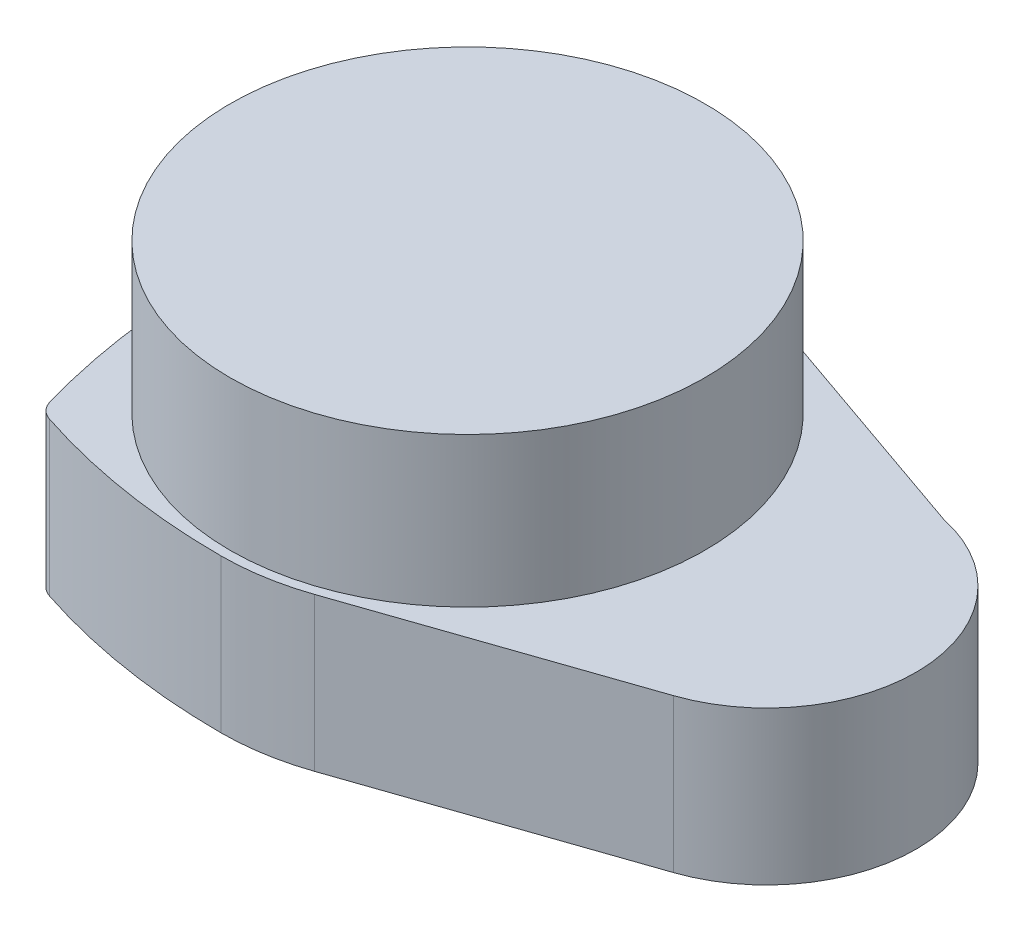
ISO-10303-21;
HEADER;
FILE_DESCRIPTION(('STEP AP214'),'2;1');
FILE_NAME('part.step','',(''),(''),'','','');
FILE_SCHEMA(('AUTOMOTIVE_DESIGN { 1 0 10303 214 1 1 1 1 }'));
ENDSEC;
DATA;
#1=APPLICATION_CONTEXT('core data for automotive mechanical design processes');
#2=APPLICATION_PROTOCOL_DEFINITION('international standard','automotive_design',2000,#1);
#3=PRODUCT_CONTEXT('',#1,'mechanical');
#4=PRODUCT('Part','Part','',(#3));
#5=PRODUCT_RELATED_PRODUCT_CATEGORY('part','',(#4));
#6=PRODUCT_DEFINITION_FORMATION('','',#4);
#7=PRODUCT_DEFINITION_CONTEXT('part definition',#1,'design');
#8=PRODUCT_DEFINITION('design','',#6,#7);
#9=PRODUCT_DEFINITION_SHAPE('','',#8);
#10=(LENGTH_UNIT() NAMED_UNIT(*) SI_UNIT(.MILLI.,.METRE.));
#11=(NAMED_UNIT(*) PLANE_ANGLE_UNIT() SI_UNIT($,.RADIAN.));
#12=(NAMED_UNIT(*) SI_UNIT($,.STERADIAN.) SOLID_ANGLE_UNIT());
#13=UNCERTAINTY_MEASURE_WITH_UNIT(LENGTH_MEASURE(1.E-05),#10,'distance_accuracy_value','');
#14=(GEOMETRIC_REPRESENTATION_CONTEXT(3) GLOBAL_UNCERTAINTY_ASSIGNED_CONTEXT((#13)) GLOBAL_UNIT_ASSIGNED_CONTEXT((#10,
#11,#12)) REPRESENTATION_CONTEXT('',''));
#15=CARTESIAN_POINT('',(0.,0.,0.));
#16=DIRECTION('',(0.,0.,1.));
#17=DIRECTION('',(1.,0.,0.));
#18=AXIS2_PLACEMENT_3D('',#15,#16,#17);
#19=CARTESIAN_POINT('',(0.,20.,0.));
#20=DIRECTION('',(0.,-1.,0.));
#21=DIRECTION('',(0.,0.,-1.));
#22=AXIS2_PLACEMENT_3D('',#19,#20,#21);
#23=CYLINDRICAL_SURFACE('',#22,31.75);
#24=CARTESIAN_POINT('',(0.,20.,0.));
#25=DIRECTION('',(0.,1.,0.));
#26=DIRECTION('',(0.,0.,1.));
#27=AXIS2_PLACEMENT_3D('',#24,#25,#26);
#28=CIRCLE('',#27,31.75);
#29=CARTESIAN_POINT('',(0.,20.,31.75));
#30=VERTEX_POINT('',#29);
#31=EDGE_CURVE('E205',#30,#30,#28,.T.);
#32=ORIENTED_EDGE('',*,*,#31,.F.);
#33=EDGE_LOOP('',(#32));
#34=FACE_BOUND('',#33,.T.);
#35=CARTESIAN_POINT('',(0.,0.,0.));
#36=DIRECTION('',(0.,1.,0.));
#37=DIRECTION('',(0.,0.,1.));
#38=AXIS2_PLACEMENT_3D('',#35,#36,#37);
#39=CIRCLE('',#38,31.75);
#40=CARTESIAN_POINT('',(0.,0.,31.75));
#41=VERTEX_POINT('',#40);
#42=EDGE_CURVE('E190',#41,#41,#39,.T.);
#43=ORIENTED_EDGE('',*,*,#42,.T.);
#44=EDGE_LOOP('',(#43));
#45=FACE_BOUND('',#44,.T.);
#46=ADVANCED_FACE('F39',(#34,#45),#23,.T.);
#47=CARTESIAN_POINT('',(0.,20.,0.));
#48=DIRECTION('',(0.,1.,0.));
#49=DIRECTION('',(0.,0.,1.));
#50=AXIS2_PLACEMENT_3D('',#47,#48,#49);
#51=PLANE('',#50);
#52=ORIENTED_EDGE('',*,*,#31,.T.);
#53=EDGE_LOOP('',(#52));
#54=FACE_BOUND('',#53,.T.);
#55=ADVANCED_FACE('F268',(#54),#51,.T.);
#56=CARTESIAN_POINT('',(44.1463840592431,-20.5,-19.5654670077986));
#57=DIRECTION('',(0.328516163866,0.,-0.944498348372705));
#58=DIRECTION('',(-0.944498348372705,0.,-0.328516163866));
#59=AXIS2_PLACEMENT_3D('',#56,#57,#58);
#60=PLANE('',#59);
#61=DIRECTION('',(-0.944498348372705,0.,-0.328516163866));
#62=VECTOR('',#61,1.);
#63=CARTESIAN_POINT('',(44.1463840592431,0.,-19.5654670077986));
#64=LINE('',#63,#62);
#65=CARTESIAN_POINT('',(44.1463840592431,0.,-19.5654670077986));
#66=VERTEX_POINT('',#65);
#67=CARTESIAN_POINT('',(11.8544434163176,0.,-30.797275387432));
#68=VERTEX_POINT('',#67);
#69=EDGE_CURVE('E168',#66,#68,#64,.T.);
#70=ORIENTED_EDGE('',*,*,#69,.F.);
#71=DIRECTION('',(0.,1.,0.));
#72=VECTOR('',#71,1.);
#73=CARTESIAN_POINT('',(44.1463840592431,-20.5,-19.5654670077986));
#74=LINE('',#73,#72);
#75=CARTESIAN_POINT('',(44.1463840592431,-20.5,-19.5654670077986));
#76=VERTEX_POINT('',#75);
#77=EDGE_CURVE('E143',#76,#66,#74,.T.);
#78=ORIENTED_EDGE('',*,*,#77,.F.);
#79=DIRECTION('',(-0.944498348372705,0.,-0.328516163866));
#80=VECTOR('',#79,1.);
#81=CARTESIAN_POINT('',(44.1463840592431,-20.5,-19.5654670077986));
#82=LINE('',#81,#80);
#83=CARTESIAN_POINT('',(11.8544434163176,-20.5,-30.797275387432));
#84=VERTEX_POINT('',#83);
#85=EDGE_CURVE('E124',#76,#84,#82,.T.);
#86=ORIENTED_EDGE('',*,*,#85,.T.);
#87=DIRECTION('',(0.,1.,0.));
#88=VECTOR('',#87,1.);
#89=CARTESIAN_POINT('',(11.8544434163176,-20.5,-30.797275387432));
#90=LINE('',#89,#88);
#91=EDGE_CURVE('E131',#84,#68,#90,.T.);
#92=ORIENTED_EDGE('',*,*,#91,.T.);
#93=EDGE_LOOP('',(#70,#78,#86,#92));
#94=FACE_BOUND('',#93,.T.);
#95=ADVANCED_FACE('F142',(#94),#60,.T.);
#96=CARTESIAN_POINT('',(40.,-20.5,0.));
#97=DIRECTION('',(0.,1.,0.));
#98=DIRECTION('',(0.,0.,1.));
#99=AXIS2_PLACEMENT_3D('',#96,#97,#98);
#100=CYLINDRICAL_SURFACE('',#99,20.);
#101=CARTESIAN_POINT('',(40.,0.,0.));
#102=DIRECTION('',(0.,-1.,0.));
#103=DIRECTION('',(0.,0.,-1.));
#104=AXIS2_PLACEMENT_3D('',#101,#102,#103);
#105=CIRCLE('',#104,20.);
#106=CARTESIAN_POINT('',(46.5,0.,18.9142803193777));
#107=VERTEX_POINT('',#106);
#108=EDGE_CURVE('E146',#66,#107,#105,.T.);
#109=ORIENTED_EDGE('',*,*,#108,.T.);
#110=DIRECTION('',(0.,1.,0.));
#111=VECTOR('',#110,1.);
#112=CARTESIAN_POINT('',(46.5,-20.5,18.9142803193777));
#113=LINE('',#112,#111);
#114=CARTESIAN_POINT('',(46.5,-20.5,18.9142803193777));
#115=VERTEX_POINT('',#114);
#116=EDGE_CURVE('E191',#115,#107,#113,.T.);
#117=ORIENTED_EDGE('',*,*,#116,.F.);
#118=CARTESIAN_POINT('',(40.,-20.5,0.));
#119=DIRECTION('',(0.,-1.,0.));
#120=DIRECTION('',(0.,0.,-1.));
#121=AXIS2_PLACEMENT_3D('',#118,#119,#120);
#122=CIRCLE('',#121,20.);
#123=EDGE_CURVE('E140',#76,#115,#122,.T.);
#124=ORIENTED_EDGE('',*,*,#123,.F.);
#125=ORIENTED_EDGE('',*,*,#77,.T.);
#126=EDGE_LOOP('',(#109,#117,#124,#125));
#127=FACE_BOUND('',#126,.T.);
#128=ADVANCED_FACE('F260',(#127),#100,.T.);
#129=CARTESIAN_POINT('',(46.5,-20.5,18.9142803193777));
#130=DIRECTION('',(-0.325,0.,-0.945714015968887));
#131=DIRECTION('',(-0.945714015968887,0.,0.325));
#132=AXIS2_PLACEMENT_3D('',#129,#130,#131);
#133=PLANE('',#132);
#134=DIRECTION('',(-0.945714015968887,0.,0.325));
#135=VECTOR('',#134,1.);
#136=CARTESIAN_POINT('',(46.5,0.,18.9142803193777));
#137=LINE('',#136,#135);
#138=CARTESIAN_POINT('',(10.725,0.,31.2085625269733));
#139=VERTEX_POINT('',#138);
#140=EDGE_CURVE('E149',#107,#139,#137,.T.);
#141=ORIENTED_EDGE('',*,*,#140,.T.);
#142=DIRECTION('',(0.,1.,0.));
#143=VECTOR('',#142,1.);
#144=CARTESIAN_POINT('',(10.725,-20.5,31.2085625269733));
#145=LINE('',#144,#143);
#146=CARTESIAN_POINT('',(10.725,-20.5,31.2085625269733));
#147=VERTEX_POINT('',#146);
#148=EDGE_CURVE('E195',#147,#139,#145,.T.);
#149=ORIENTED_EDGE('',*,*,#148,.F.);
#150=DIRECTION('',(-0.945714015968887,0.,0.325));
#151=VECTOR('',#150,1.);
#152=CARTESIAN_POINT('',(46.5,-20.5,18.9142803193777));
#153=LINE('',#152,#151);
#154=EDGE_CURVE('E163',#115,#147,#153,.T.);
#155=ORIENTED_EDGE('',*,*,#154,.F.);
#156=ORIENTED_EDGE('',*,*,#116,.T.);
#157=EDGE_LOOP('',(#141,#149,#155,#156));
#158=FACE_BOUND('',#157,.T.);
#159=ADVANCED_FACE('F256',(#158),#133,.F.);
#160=CARTESIAN_POINT('',(0.,-20.5,0.));
#161=DIRECTION('',(0.,1.,0.));
#162=DIRECTION('',(0.,0.,1.));
#163=AXIS2_PLACEMENT_3D('',#160,#161,#162);
#164=CYLINDRICAL_SURFACE('',#163,33.);
#165=CARTESIAN_POINT('',(0.,0.,0.));
#166=DIRECTION('',(0.,-1.,0.));
#167=DIRECTION('',(0.,0.,-1.));
#168=AXIS2_PLACEMENT_3D('',#165,#166,#167);
#169=CIRCLE('',#168,33.);
#170=CARTESIAN_POINT('',(-1.1319821696323E-13,0.,33.));
#171=VERTEX_POINT('',#170);
#172=EDGE_CURVE('E183',#139,#171,#169,.T.);
#173=ORIENTED_EDGE('',*,*,#172,.T.);
#174=DIRECTION('',(0.,1.,0.));
#175=VECTOR('',#174,1.);
#176=CARTESIAN_POINT('',(-1.1319821696323E-13,-20.5,33.));
#177=LINE('',#176,#175);
#178=CARTESIAN_POINT('',(-1.1319821696323E-13,-20.5,33.));
#179=VERTEX_POINT('',#178);
#180=EDGE_CURVE('E199',#179,#171,#177,.T.);
#181=ORIENTED_EDGE('',*,*,#180,.F.);
#182=CARTESIAN_POINT('',(0.,-20.5,0.));
#183=DIRECTION('',(0.,-1.,0.));
#184=DIRECTION('',(0.,0.,-1.));
#185=AXIS2_PLACEMENT_3D('',#182,#183,#184);
#186=CIRCLE('',#185,33.);
#187=EDGE_CURVE('E160',#147,#179,#186,.T.);
#188=ORIENTED_EDGE('',*,*,#187,.F.);
#189=ORIENTED_EDGE('',*,*,#148,.T.);
#190=EDGE_LOOP('',(#173,#181,#188,#189));
#191=FACE_BOUND('',#190,.T.);
#192=ADVANCED_FACE('F251',(#191),#164,.T.);
#193=CARTESIAN_POINT('',(3.4565665254547E-13,-20.5,-54.2476089400615));
#194=DIRECTION('',(0.,1.,0.));
#195=DIRECTION('',(0.,0.,1.));
#196=AXIS2_PLACEMENT_3D('',#193,#194,#195);
#197=CYLINDRICAL_SURFACE('',#196,87.2476089400615);
#198=CARTESIAN_POINT('',(3.4565665254547E-13,0.,-54.2476089400615));
#199=DIRECTION('',(0.,-1.,0.));
#200=DIRECTION('',(0.,0.,-1.));
#201=AXIS2_PLACEMENT_3D('',#198,#199,#200);
#202=CIRCLE('',#201,87.2476089400615);
#203=CARTESIAN_POINT('',(-27.316652257852,0.,28.6133938005611));
#204=VERTEX_POINT('',#203);
#205=EDGE_CURVE('E180',#171,#204,#202,.T.);
#206=ORIENTED_EDGE('',*,*,#205,.T.);
#207=DIRECTION('',(0.,1.,0.));
#208=VECTOR('',#207,1.);
#209=CARTESIAN_POINT('',(-27.316652257852,-20.5,28.6133938005611));
#210=LINE('',#209,#208);
#211=CARTESIAN_POINT('',(-27.316652257852,-20.5,28.6133938005611));
#212=VERTEX_POINT('',#211);
#213=EDGE_CURVE('E11',#204,#212,#210,.F.);
#214=ORIENTED_EDGE('',*,*,#213,.T.);
#215=CARTESIAN_POINT('',(3.4565665254547E-13,-20.5,-54.2476089400615));
#216=DIRECTION('',(0.,-1.,0.));
#217=DIRECTION('',(0.,0.,-1.));
#218=AXIS2_PLACEMENT_3D('',#215,#216,#217);
#219=CIRCLE('',#218,87.2476089400615);
#220=EDGE_CURVE('E157',#179,#212,#219,.T.);
#221=ORIENTED_EDGE('',*,*,#220,.F.);
#222=ORIENTED_EDGE('',*,*,#180,.T.);
#223=EDGE_LOOP('',(#206,#214,#221,#222));
#224=FACE_BOUND('',#223,.T.);
#225=ADVANCED_FACE('F247',(#224),#197,.T.);
#226=CARTESIAN_POINT('',(63.4292474889733,-20.5,0.));
#227=DIRECTION('',(0.,1.,0.));
#228=DIRECTION('',(0.,0.,1.));
#229=AXIS2_PLACEMENT_3D('',#226,#227,#228);
#230=CYLINDRICAL_SURFACE('',#229,96.4292474889734);
#231=CARTESIAN_POINT('',(63.4292474889733,0.,0.));
#232=DIRECTION('',(0.,-1.,0.));
#233=DIRECTION('',(0.,0.,-1.));
#234=AXIS2_PLACEMENT_3D('',#231,#232,#233);
#235=CIRCLE('',#234,96.4292474889734);
#236=CARTESIAN_POINT('',(-29.2610499224988,0.,26.5915125004675));
#237=VERTEX_POINT('',#236);
#238=CARTESIAN_POINT('',(-29.2610499224988,0.,-26.5915125004675));
#239=VERTEX_POINT('',#238);
#240=EDGE_CURVE('E177',#237,#239,#235,.T.);
#241=ORIENTED_EDGE('',*,*,#240,.T.);
#242=DIRECTION('',(0.,1.,0.));
#243=VECTOR('',#242,1.);
#244=CARTESIAN_POINT('',(-29.2610499224988,-20.5,-26.5915125004675));
#245=LINE('',#244,#243);
#246=CARTESIAN_POINT('',(-29.2610499224988,-20.5,-26.5915125004675));
#247=VERTEX_POINT('',#246);
#248=EDGE_CURVE('E61',#239,#247,#245,.F.);
#249=ORIENTED_EDGE('',*,*,#248,.T.);
#250=CARTESIAN_POINT('',(63.4292474889733,-20.5,0.));
#251=DIRECTION('',(0.,-1.,0.));
#252=DIRECTION('',(0.,0.,-1.));
#253=AXIS2_PLACEMENT_3D('',#250,#251,#252);
#254=CIRCLE('',#253,96.4292474889734);
#255=CARTESIAN_POINT('',(-29.2610499224988,-20.5,26.5915125004675));
#256=VERTEX_POINT('',#255);
#257=EDGE_CURVE('E154',#256,#247,#254,.T.);
#258=ORIENTED_EDGE('',*,*,#257,.F.);
#259=DIRECTION('',(0.,1.,0.));
#260=VECTOR('',#259,1.);
#261=CARTESIAN_POINT('',(-29.2610499224988,-20.5,26.5915125004675));
#262=LINE('',#261,#260);
#263=EDGE_CURVE('E222',#256,#237,#262,.T.);
#264=ORIENTED_EDGE('',*,*,#263,.T.);
#265=EDGE_LOOP('',(#241,#249,#258,#264));
#266=FACE_BOUND('',#265,.T.);
#267=ADVANCED_FACE('F241',(#266),#230,.T.);
#268=CARTESIAN_POINT('',(3.4565665254547E-13,-20.5,54.2476089400615));
#269=DIRECTION('',(0.,1.,0.));
#270=DIRECTION('',(0.,0.,1.));
#271=AXIS2_PLACEMENT_3D('',#268,#269,#270);
#272=CYLINDRICAL_SURFACE('',#271,87.2476089400615);
#273=CARTESIAN_POINT('',(3.4565665254547E-13,-20.5,54.2476089400615));
#274=DIRECTION('',(0.,1.,0.));
#275=DIRECTION('',(0.,0.,1.));
#276=AXIS2_PLACEMENT_3D('',#273,#274,#275);
#277=CIRCLE('',#276,87.2476089400615);
#278=CARTESIAN_POINT('',(3.56341403047641E-13,-20.5,-33.));
#279=VERTEX_POINT('',#278);
#280=CARTESIAN_POINT('',(-27.316652257852,-20.5,-28.6133938005611));
#281=VERTEX_POINT('',#280);
#282=EDGE_CURVE('E126',#279,#281,#277,.T.);
#283=ORIENTED_EDGE('',*,*,#282,.T.);
#284=DIRECTION('',(0.,1.,0.));
#285=VECTOR('',#284,1.);
#286=CARTESIAN_POINT('',(-27.316652257852,-20.5,-28.6133938005611));
#287=LINE('',#286,#285);
#288=CARTESIAN_POINT('',(-27.316652257852,0.,-28.6133938005611));
#289=VERTEX_POINT('',#288);
#290=EDGE_CURVE('E209',#281,#289,#287,.T.);
#291=ORIENTED_EDGE('',*,*,#290,.T.);
#292=CARTESIAN_POINT('',(3.4565665254547E-13,0.,54.2476089400615));
#293=DIRECTION('',(0.,1.,0.));
#294=DIRECTION('',(0.,0.,1.));
#295=AXIS2_PLACEMENT_3D('',#292,#293,#294);
#296=CIRCLE('',#295,87.2476089400615);
#297=CARTESIAN_POINT('',(3.56341403047641E-13,0.,-33.));
#298=VERTEX_POINT('',#297);
#299=EDGE_CURVE('E173',#298,#289,#296,.T.);
#300=ORIENTED_EDGE('',*,*,#299,.F.);
#301=DIRECTION('',(0.,1.,0.));
#302=VECTOR('',#301,1.);
#303=CARTESIAN_POINT('',(3.56341403047641E-13,-20.5,-33.));
#304=LINE('',#303,#302);
#305=EDGE_CURVE('E139',#279,#298,#304,.T.);
#306=ORIENTED_EDGE('',*,*,#305,.F.);
#307=EDGE_LOOP('',(#283,#291,#300,#306));
#308=FACE_BOUND('',#307,.T.);
#309=ADVANCED_FACE('F235',(#308),#272,.T.);
#310=CARTESIAN_POINT('',(0.,-20.5,0.));
#311=DIRECTION('',(0.,1.,0.));
#312=DIRECTION('',(0.,0.,1.));
#313=AXIS2_PLACEMENT_3D('',#310,#311,#312);
#314=CYLINDRICAL_SURFACE('',#313,33.);
#315=CARTESIAN_POINT('',(0.,0.,0.));
#316=DIRECTION('',(0.,-1.,0.));
#317=DIRECTION('',(0.,0.,-1.));
#318=AXIS2_PLACEMENT_3D('',#315,#316,#317);
#319=CIRCLE('',#318,33.);
#320=EDGE_CURVE('E134',#298,#68,#319,.T.);
#321=ORIENTED_EDGE('',*,*,#320,.T.);
#322=ORIENTED_EDGE('',*,*,#91,.F.);
#323=CARTESIAN_POINT('',(0.,-20.5,0.));
#324=DIRECTION('',(0.,-1.,0.));
#325=DIRECTION('',(0.,0.,-1.));
#326=AXIS2_PLACEMENT_3D('',#323,#324,#325);
#327=CIRCLE('',#326,33.);
#328=EDGE_CURVE('E120',#279,#84,#327,.T.);
#329=ORIENTED_EDGE('',*,*,#328,.F.);
#330=ORIENTED_EDGE('',*,*,#305,.T.);
#331=EDGE_LOOP('',(#321,#322,#329,#330));
#332=FACE_BOUND('',#331,.T.);
#333=ADVANCED_FACE('F132',(#332),#314,.T.);
#334=CARTESIAN_POINT('',(0.,-20.5,0.));
#335=DIRECTION('',(0.,-1.,0.));
#336=DIRECTION('',(0.,0.,-1.));
#337=AXIS2_PLACEMENT_3D('',#334,#335,#336);
#338=PLANE('',#337);
#339=ORIENTED_EDGE('',*,*,#257,.T.);
#340=CARTESIAN_POINT('',(-26.3773719982651,-20.5,-25.7642268005504));
#341=DIRECTION('',(0.,-1.,0.));
#342=DIRECTION('',(0.,0.,-1.));
#343=AXIS2_PLACEMENT_3D('',#340,#341,#342);
#344=CIRCLE('',#343,3.);
#345=EDGE_CURVE('E48',#247,#281,#344,.T.);
#346=ORIENTED_EDGE('',*,*,#345,.T.);
#347=ORIENTED_EDGE('',*,*,#282,.F.);
#348=ORIENTED_EDGE('',*,*,#328,.T.);
#349=ORIENTED_EDGE('',*,*,#85,.F.);
#350=ORIENTED_EDGE('',*,*,#123,.T.);
#351=ORIENTED_EDGE('',*,*,#154,.T.);
#352=ORIENTED_EDGE('',*,*,#187,.T.);
#353=ORIENTED_EDGE('',*,*,#220,.T.);
#354=CARTESIAN_POINT('',(-26.3773719982651,-20.5,25.7642268005504));
#355=DIRECTION('',(0.,-1.,0.));
#356=DIRECTION('',(0.,0.,-1.));
#357=AXIS2_PLACEMENT_3D('',#354,#355,#356);
#358=CIRCLE('',#357,3.);
#359=EDGE_CURVE('E228',#212,#256,#358,.T.);
#360=ORIENTED_EDGE('',*,*,#359,.T.);
#361=EDGE_LOOP('',(#339,#346,#347,#348,#349,#350,#351,#352,#353,#360));
#362=FACE_BOUND('',#361,.T.);
#363=ADVANCED_FACE('F122',(#362),#338,.T.);
#364=CARTESIAN_POINT('',(0.,0.,0.));
#365=DIRECTION('',(0.,-1.,0.));
#366=DIRECTION('',(0.,0.,-1.));
#367=AXIS2_PLACEMENT_3D('',#364,#365,#366);
#368=PLANE('',#367);
#369=ORIENTED_EDGE('',*,*,#42,.F.);
#370=EDGE_LOOP('',(#369));
#371=FACE_BOUND('',#370,.T.);
#372=ORIENTED_EDGE('',*,*,#299,.T.);
#373=CARTESIAN_POINT('',(-26.3773719982651,0.,-25.7642268005504));
#374=DIRECTION('',(0.,-1.,0.));
#375=DIRECTION('',(0.,0.,-1.));
#376=AXIS2_PLACEMENT_3D('',#373,#374,#375);
#377=CIRCLE('',#376,3.);
#378=EDGE_CURVE('E219',#289,#239,#377,.F.);
#379=ORIENTED_EDGE('',*,*,#378,.T.);
#380=ORIENTED_EDGE('',*,*,#240,.F.);
#381=CARTESIAN_POINT('',(-26.3773719982651,0.,25.7642268005504));
#382=DIRECTION('',(0.,-1.,0.));
#383=DIRECTION('',(0.,0.,-1.));
#384=AXIS2_PLACEMENT_3D('',#381,#382,#383);
#385=CIRCLE('',#384,3.);
#386=EDGE_CURVE('E216',#237,#204,#385,.F.);
#387=ORIENTED_EDGE('',*,*,#386,.T.);
#388=ORIENTED_EDGE('',*,*,#205,.F.);
#389=ORIENTED_EDGE('',*,*,#172,.F.);
#390=ORIENTED_EDGE('',*,*,#140,.F.);
#391=ORIENTED_EDGE('',*,*,#108,.F.);
#392=ORIENTED_EDGE('',*,*,#69,.T.);
#393=ORIENTED_EDGE('',*,*,#320,.F.);
#394=EDGE_LOOP('',(#372,#379,#380,#387,#388,#389,#390,#391,#392,#393));
#395=FACE_BOUND('',#394,.T.);
#396=ADVANCED_FACE('F240',(#371,#395),#368,.F.);
#397=CARTESIAN_POINT('',(-26.3773719982651,-20.5,-25.7642268005504));
#398=DIRECTION('',(0.,1.,0.));
#399=DIRECTION('',(0.,0.,1.));
#400=AXIS2_PLACEMENT_3D('',#397,#398,#399);
#401=CYLINDRICAL_SURFACE('',#400,3.);
#402=ORIENTED_EDGE('',*,*,#345,.F.);
#403=ORIENTED_EDGE('',*,*,#248,.F.);
#404=ORIENTED_EDGE('',*,*,#378,.F.);
#405=ORIENTED_EDGE('',*,*,#290,.F.);
#406=EDGE_LOOP('',(#402,#403,#404,#405));
#407=FACE_BOUND('',#406,.T.);
#408=ADVANCED_FACE('F237',(#407),#401,.T.);
#409=CARTESIAN_POINT('',(-26.3773719982651,-20.5,25.7642268005504));
#410=DIRECTION('',(0.,1.,0.));
#411=DIRECTION('',(0.,0.,1.));
#412=AXIS2_PLACEMENT_3D('',#409,#410,#411);
#413=CYLINDRICAL_SURFACE('',#412,3.);
#414=ORIENTED_EDGE('',*,*,#359,.F.);
#415=ORIENTED_EDGE('',*,*,#213,.F.);
#416=ORIENTED_EDGE('',*,*,#386,.F.);
#417=ORIENTED_EDGE('',*,*,#263,.F.);
#418=EDGE_LOOP('',(#414,#415,#416,#417));
#419=FACE_BOUND('',#418,.T.);
#420=ADVANCED_FACE('F41',(#419),#413,.T.);
#421=CLOSED_SHELL('',(#46,#55,#95,#128,#159,#192,#225,#267,#309,#333,#363,#396,#408,#420));
#422=MANIFOLD_SOLID_BREP('B2',#421);
#423=ADVANCED_BREP_SHAPE_REPRESENTATION('',(#18,#422),#14);
#424=SHAPE_DEFINITION_REPRESENTATION(#9,#423);
ENDSEC;
END-ISO-10303-21;
